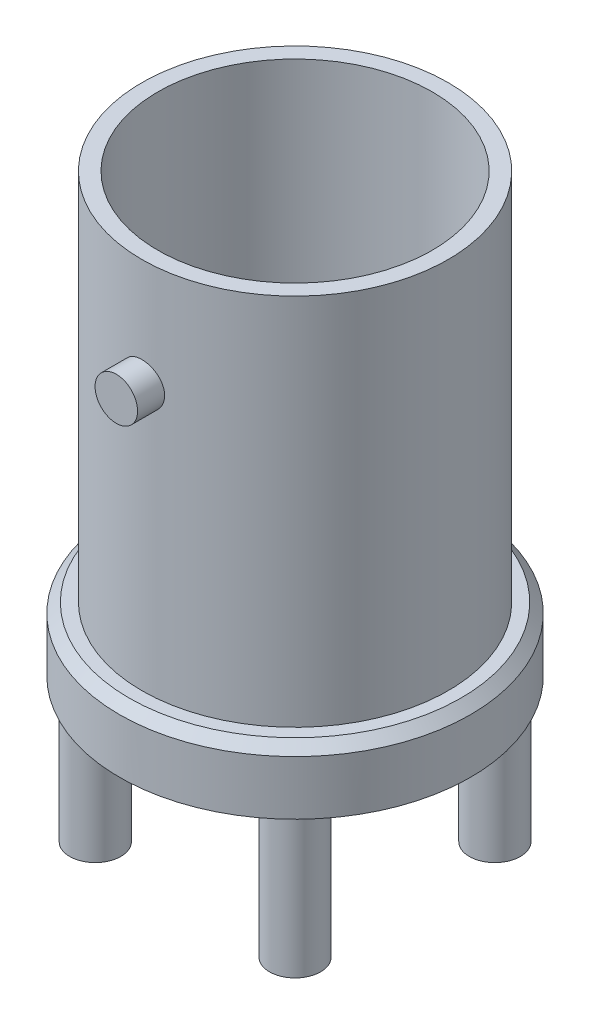
ISO-10303-21;
HEADER;
FILE_DESCRIPTION(('STEP AP214'),'2;1');
FILE_NAME('part.step','',(''),(''),'','','');
FILE_SCHEMA(('AUTOMOTIVE_DESIGN { 1 0 10303 214 1 1 1 1 }'));
ENDSEC;
DATA;
#1=APPLICATION_CONTEXT('core data for automotive mechanical design processes');
#2=APPLICATION_PROTOCOL_DEFINITION('international standard','automotive_design',2000,#1);
#3=PRODUCT_CONTEXT('',#1,'mechanical');
#4=PRODUCT('Part','Part','',(#3));
#5=PRODUCT_RELATED_PRODUCT_CATEGORY('part','',(#4));
#6=PRODUCT_DEFINITION_FORMATION('','',#4);
#7=PRODUCT_DEFINITION_CONTEXT('part definition',#1,'design');
#8=PRODUCT_DEFINITION('design','',#6,#7);
#9=PRODUCT_DEFINITION_SHAPE('','',#8);
#10=(LENGTH_UNIT() NAMED_UNIT(*) SI_UNIT(.MILLI.,.METRE.));
#11=(NAMED_UNIT(*) PLANE_ANGLE_UNIT() SI_UNIT($,.RADIAN.));
#12=(NAMED_UNIT(*) SI_UNIT($,.STERADIAN.) SOLID_ANGLE_UNIT());
#13=UNCERTAINTY_MEASURE_WITH_UNIT(LENGTH_MEASURE(1.E-05),#10,'distance_accuracy_value','');
#14=(GEOMETRIC_REPRESENTATION_CONTEXT(3) GLOBAL_UNCERTAINTY_ASSIGNED_CONTEXT((#13)) GLOBAL_UNIT_ASSIGNED_CONTEXT((#10,
#11,#12)) REPRESENTATION_CONTEXT('',''));
#15=CARTESIAN_POINT('',(0.,0.,0.));
#16=DIRECTION('',(0.,0.,1.));
#17=DIRECTION('',(1.,0.,0.));
#18=AXIS2_PLACEMENT_3D('',#15,#16,#17);
#19=CARTESIAN_POINT('',(0.,0.,0.));
#20=DIRECTION('',(0.,-1.,0.));
#21=DIRECTION('',(0.,0.,-1.));
#22=AXIS2_PLACEMENT_3D('',#19,#20,#21);
#23=CYLINDRICAL_SURFACE('',#22,4.8);
#24=CARTESIAN_POINT('',(0.,10.9866557356674,-4.8));
#25=CARTESIAN_POINT('',(0.0372305672435857,10.9866541772579,-4.79999943591072));
#26=CARTESIAN_POINT('',(0.0744835207053437,10.9835244096424,-4.79956228286493));
#27=CARTESIAN_POINT('',(0.147950338795849,10.9710899572942,-4.79786045376256));
#28=CARTESIAN_POINT('',(0.184163118882719,10.9617790553619,-4.79659494453453));
#29=CARTESIAN_POINT('',(0.254475568466827,10.9372640546069,-4.79337878338264));
#30=CARTESIAN_POINT('',(0.288576733046903,10.9220641819788,-4.7914286228898));
#31=CARTESIAN_POINT('',(0.353738543683553,10.8862125438414,-4.7870593102258));
#32=CARTESIAN_POINT('',(0.384799657431738,10.8655616187531,-4.78464023036597));
#33=CARTESIAN_POINT('',(0.443214506379492,10.8192457770284,-4.77958439018553));
#34=CARTESIAN_POINT('',(0.470544821254601,10.7935514523063,-4.77694640819485));
#35=CARTESIAN_POINT('',(0.520520361912578,10.7379414167379,-4.77175977663024));
#36=CARTESIAN_POINT('',(0.543165333142092,10.7080254766811,-4.76921113191622));
#37=CARTESIAN_POINT('',(0.583216778246804,10.6446663767408,-4.76447983009036));
#38=CARTESIAN_POINT('',(0.600600917251182,10.6112089702514,-4.76229875035522));
#39=CARTESIAN_POINT('',(0.629494542571579,10.5418140759254,-4.75856597725692));
#40=CARTESIAN_POINT('',(0.641004302890405,10.5058767038525,-4.7570142545389));
#41=CARTESIAN_POINT('',(0.657750418313272,10.4327869202716,-4.75472776086385));
#42=CARTESIAN_POINT('',(0.663026630302736,10.3956438058595,-4.75398780174465));
#43=CARTESIAN_POINT('',(0.667279283724438,10.3209925579391,-4.75339281430208));
#44=CARTESIAN_POINT('',(0.666256035712497,10.283484442516,-4.75353774235483));
#45=CARTESIAN_POINT('',(0.657971454816321,10.2094476747588,-4.75469140728667));
#46=CARTESIAN_POINT('',(0.650754282273152,10.1729139720338,-4.75569402897138));
#47=CARTESIAN_POINT('',(0.630355742930508,10.1015812177147,-4.75844056674966));
#48=CARTESIAN_POINT('',(0.617174229764157,10.0667822087137,-4.76018450103521));
#49=CARTESIAN_POINT('',(0.585174535251701,9.99977096901379,-4.76422400770246));
#50=CARTESIAN_POINT('',(0.566337421417103,9.96756789502594,-4.76652142772793));
#51=CARTESIAN_POINT('',(0.523574752895926,9.90676308104811,-4.77140766894461));
#52=CARTESIAN_POINT('',(0.499648911700272,9.87816154397879,-4.77399650653956));
#53=CARTESIAN_POINT('',(0.447144453588417,9.82511557615971,-4.77920098675282));
#54=CARTESIAN_POINT('',(0.418527823061185,9.80070875916859,-4.78181666938001));
#55=CARTESIAN_POINT('',(0.357584287752925,9.75703879099449,-4.78675950432496));
#56=CARTESIAN_POINT('',(0.32525737066453,9.73777565687429,-4.78908665568559));
#57=CARTESIAN_POINT('',(0.257779993072808,9.70493882982415,-4.79319216677937));
#58=CARTESIAN_POINT('',(0.222628229067748,9.69136778163162,-4.79497027130563));
#59=CARTESIAN_POINT('',(0.150514535006727,9.67033171909485,-4.79777513748893));
#60=CARTESIAN_POINT('',(0.113552709720074,9.66286635178551,-4.7988019425777));
#61=CARTESIAN_POINT('',(0.0391930135245538,9.65430298583646,-4.79998281598001));
#62=CARTESIAN_POINT('',(0.00180121167003114,9.65315322782203,-4.80014397839784));
#63=CARTESIAN_POINT('',(-0.0726416129808275,9.6571167045968,-4.79959464499947));
#64=CARTESIAN_POINT('',(-0.109692644745008,9.66222977409301,-4.7988841721881));
#65=CARTESIAN_POINT('',(-0.18224731101868,9.678530740402,-4.796675794642));
#66=CARTESIAN_POINT('',(-0.217756661339992,9.68969367245089,-4.79518112669276));
#67=CARTESIAN_POINT('',(-0.286399578240393,9.71775133769001,-4.79157152926214));
#68=CARTESIAN_POINT('',(-0.319533047371459,9.73464630582003,-4.78945657435744));
#69=CARTESIAN_POINT('',(-0.382712943967388,9.77381166952056,-4.78482411007179));
#70=CARTESIAN_POINT('',(-0.412738646135796,9.79611520354011,-4.78230415263116));
#71=CARTESIAN_POINT('',(-0.468639143930064,9.84541809913695,-4.77715049666598));
#72=CARTESIAN_POINT('',(-0.494513734487119,9.87241769256673,-4.77451679253038));
#73=CARTESIAN_POINT('',(-0.54156366341593,9.93057559405263,-4.76941026479457));
#74=CARTESIAN_POINT('',(-0.562704483352997,9.96176195568039,-4.76693871031928));
#75=CARTESIAN_POINT('',(-0.599447519365901,10.0272733964577,-4.76245805568987));
#76=CARTESIAN_POINT('',(-0.61504986756819,10.0615984007068,-4.76044894450405));
#77=CARTESIAN_POINT('',(-0.640218439390525,10.1323058745652,-4.75712960636872));
#78=CARTESIAN_POINT('',(-0.649803435823443,10.1686815555548,-4.75581720782732));
#79=CARTESIAN_POINT('',(-0.662725321597661,10.2425457355782,-4.75403390898769));
#80=CARTESIAN_POINT('',(-0.666062575513927,10.2800341695497,-4.7535629595884));
#81=CARTESIAN_POINT('',(-0.666386500618632,10.3547159679626,-4.75351753138721));
#82=CARTESIAN_POINT('',(-0.663427421223862,10.3919091039444,-4.75393539453582));
#83=CARTESIAN_POINT('',(-0.651358284873555,10.4652636111834,-4.75560395022369));
#84=CARTESIAN_POINT('',(-0.642248232448417,10.5014249832006,-4.75685464214953));
#85=CARTESIAN_POINT('',(-0.618153910196123,10.571678127684,-4.7600454014621));
#86=CARTESIAN_POINT('',(-0.603172883375382,10.6057710307443,-4.76198508820688));
#87=CARTESIAN_POINT('',(-0.567767210632652,10.6709681020131,-4.76633581834026));
#88=CARTESIAN_POINT('',(-0.547342434396933,10.7020721986505,-4.7687468730122));
#89=CARTESIAN_POINT('',(-0.501429919148226,10.7606851992116,-4.77379348906151));
#90=CARTESIAN_POINT('',(-0.47590186483371,10.7881623813836,-4.77643073601569));
#91=CARTESIAN_POINT('',(-0.420592385291024,10.8384627894217,-4.78161812652661));
#92=CARTESIAN_POINT('',(-0.390809966833686,10.8612849254857,-4.78416824957054));
#93=CARTESIAN_POINT('',(-0.327674574812205,10.9017211291018,-4.78890753502859));
#94=CARTESIAN_POINT('',(-0.294305524605614,10.9193102921479,-4.79109495010086));
#95=CARTESIAN_POINT('',(-0.225073746627821,10.9486090093766,-4.79484502380725));
#96=CARTESIAN_POINT('',(-0.189213707673959,10.9603247944648,-4.79640834416606));
#97=CARTESIAN_POINT('',(-0.127650679172182,10.9748170026485,-4.79836776872663));
#98=CARTESIAN_POINT('',(-0.102331771459389,10.9792499352586,-4.79897678852722));
#99=CARTESIAN_POINT('',(-0.0513454565050206,10.9851698246193,-4.79979309670435));
#100=CARTESIAN_POINT('',(-0.0256780527129196,10.986656810508,-4.80000038905435));
#101=CARTESIAN_POINT('',(0.,10.9866557356674,-4.8));
#102=B_SPLINE_CURVE_WITH_KNOTS('',3,(#24,#25,#26,#27,#28,#29,#30,#31,#32,#33,#34,#35,#36,#37,
#38,#39,#40,#41,#42,#43,#44,#45,#46,#47,#48,#49,#50,#51,#52,#53,#54,#55,#56,#57,#58,#59,#60,#61,
#62,#63,#64,#65,#66,#67,#68,#69,#70,#71,#72,#73,#74,#75,#76,#77,#78,#79,#80,#81,#82,#83,#84,#85,
#86,#87,#88,#89,#90,#91,#92,#93,#94,#95,#96,#97,#98,#99,#100,#101),.UNSPECIFIED.,.T.,.F.,(4,2,2,
2,2,2,2,2,2,2,2,2,2,2,2,2,2,2,2,2,2,2,2,2,2,2,2,2,2,2,2,2,2,2,2,2,2,2,4),(0.,0.11159788891167,
0.223308197274505,0.334938485268107,0.446551572600065,0.558835920879091,0.671126367933121,
0.783887063919969,0.896642499849001,1.00867301478618,1.12069800679759,1.23193087579668,
1.34316647463491,1.45477867422034,1.56639715953794,1.67896949414873,1.79154220218328,
1.90416715755256,2.01678560169246,2.1284796923273,2.24017083511565,2.35140455510968,
2.46264283480703,2.57458070513552,2.68652410359811,2.79925897245143,2.91199115170729,
3.02436986041962,3.13674201128468,3.24814988243331,3.3595576715264,3.47090400777541,
3.58225300969814,3.69451913353006,3.80681151011749,3.91963005470989,4.03232865858041,
4.10929887499883,4.18626833010747),.UNSPECIFIED.);
#103=CARTESIAN_POINT('',(0.,10.9866557356674,-4.8));
#104=VERTEX_POINT('',#103);
#105=EDGE_CURVE('E72',#104,#104,#102,.T.);
#106=ORIENTED_EDGE('',*,*,#105,.F.);
#107=EDGE_LOOP('',(#106));
#108=FACE_BOUND('',#107,.T.);
#109=CARTESIAN_POINT('',(0.,2.,0.));
#110=DIRECTION('',(0.,-1.,0.));
#111=DIRECTION('',(0.,0.,-1.));
#112=AXIS2_PLACEMENT_3D('',#109,#110,#111);
#113=CIRCLE('',#112,4.8);
#114=CARTESIAN_POINT('',(0.,2.,-4.8));
#115=VERTEX_POINT('',#114);
#116=EDGE_CURVE('E115',#115,#115,#113,.T.);
#117=ORIENTED_EDGE('',*,*,#116,.F.);
#118=EDGE_LOOP('',(#117));
#119=FACE_BOUND('',#118,.T.);
#120=CARTESIAN_POINT('',(0.,13.7,0.));
#121=DIRECTION('',(0.,-1.,0.));
#122=DIRECTION('',(0.,0.,-1.));
#123=AXIS2_PLACEMENT_3D('',#120,#121,#122);
#124=CIRCLE('',#123,4.8);
#125=CARTESIAN_POINT('',(0.,13.7,-4.8));
#126=VERTEX_POINT('',#125);
#127=EDGE_CURVE('E119',#126,#126,#124,.T.);
#128=ORIENTED_EDGE('',*,*,#127,.T.);
#129=EDGE_LOOP('',(#128));
#130=FACE_BOUND('',#129,.T.);
#131=CARTESIAN_POINT('',(0.666231496649461,10.320424239018,4.75353927015148));
#132=CARTESIAN_POINT('',(0.666229936550828,10.2831956191238,4.75353985491877));
#133=CARTESIAN_POINT('',(0.663100485282348,10.2459446075508,4.75398134695433));
#134=CARTESIAN_POINT('',(0.650667403557462,10.1724818235577,4.75569866580197));
#135=CARTESIAN_POINT('',(0.641357548952173,10.1362711372186,4.75697533368244));
#136=CARTESIAN_POINT('',(0.61684561134306,10.0659631170306,4.76021568093885));
#137=CARTESIAN_POINT('',(0.601647804125925,10.0318642703738,4.76217886167383));
#138=CARTESIAN_POINT('',(0.565801031449259,9.96670635131017,4.76657043804883));
#139=CARTESIAN_POINT('',(0.545152901425771,9.93564681403138,4.7689987623751));
#140=CARTESIAN_POINT('',(0.498839896527114,9.87723021685119,4.77406568459587));
#141=CARTESIAN_POINT('',(0.473144987927955,9.84989706909849,4.77670548237696));
#142=CARTESIAN_POINT('',(0.417532590897519,9.79991605179951,4.78188716776775));
#143=CARTESIAN_POINT('',(0.387614881030933,9.77726842810647,4.78442905023407));
#144=CARTESIAN_POINT('',(0.3242541987872,9.73721418391903,4.7891409431009));
#145=CARTESIAN_POINT('',(0.290797284297003,9.71982941810439,4.79130938712015));
#146=CARTESIAN_POINT('',(0.221403458245781,9.69093449866559,4.79501683306244));
#147=CARTESIAN_POINT('',(0.185466659406182,9.67942407822654,4.79655586357303));
#148=CARTESIAN_POINT('',(0.112378760040426,9.66267662084454,4.79882261620271));
#149=CARTESIAN_POINT('',(0.0752369711561885,9.65739965663439,4.79955549984281));
#150=CARTESIAN_POINT('',(0.000588328158090513,9.65314503936252,4.80014504361317));
#151=CARTESIAN_POINT('',(-0.0369185083603688,9.65416708417336,4.80000174576884));
#152=CARTESIAN_POINT('',(-0.110960513507225,9.66244973449761,4.79885922059703));
#153=CARTESIAN_POINT('',(-0.147500590279587,9.66966739184311,4.79786588589632));
#154=CARTESIAN_POINT('',(-0.218845841379247,9.6900691002499,4.79514147844014));
#155=CARTESIAN_POINT('',(-0.25365097637983,9.70325328648899,4.79341038897014));
#156=CARTESIAN_POINT('',(-0.320669741249341,9.73525856773205,4.78939482315632));
#157=CARTESIAN_POINT('',(-0.352874511650253,9.75409798019926,4.78710855323324));
#158=CARTESIAN_POINT('',(-0.413681748787757,9.79686558275932,4.78223789781825));
#159=CARTESIAN_POINT('',(-0.442284011962511,9.82079406020763,4.77965349549599));
#160=CARTESIAN_POINT('',(-0.495327098213319,9.87330042072059,4.77444957501159));
#161=CARTESIAN_POINT('',(-0.519730836863161,9.90191577116184,4.77182994443027));
#162=CARTESIAN_POINT('',(-0.563395199341171,9.96285563711392,4.7668721680603));
#163=CARTESIAN_POINT('',(-0.582655799507532,9.99518016968843,4.7645340235667));
#164=CARTESIAN_POINT('',(-0.615490790134166,10.0626568345223,4.76040402092981));
#165=CARTESIAN_POINT('',(-0.629061765382361,10.0978106500206,4.7586124910685));
#166=CARTESIAN_POINT('',(-0.650097056464327,10.1699288130797,4.75578463702071));
#167=CARTESIAN_POINT('',(-0.657561738121986,10.2068930520386,4.75474826759348));
#168=CARTESIAN_POINT('',(-0.66612251130172,10.2812539757682,4.75355652369583));
#169=CARTESIAN_POINT('',(-0.66727099318377,10.3186445171815,4.75339390209614));
#170=CARTESIAN_POINT('',(-0.663305413974282,10.393084516924,4.75394886167475));
#171=CARTESIAN_POINT('',(-0.658191518420339,10.4301339842431,4.7546664195867));
#172=CARTESIAN_POINT('',(-0.641890633539786,10.5026803313516,4.75689425186981));
#173=CARTESIAN_POINT('',(-0.630729400274337,10.5381831106737,4.75840116342753));
#174=CARTESIAN_POINT('',(-0.602677326308339,10.6068136345859,4.76203516315298));
#175=CARTESIAN_POINT('',(-0.58578624053281,10.6399412775142,4.76416227784724));
#176=CARTESIAN_POINT('',(-0.546626685821529,10.7031170341326,4.76881422278208));
#177=CARTESIAN_POINT('',(-0.524324094722432,10.7331438109639,4.77134153989527));
#178=CARTESIAN_POINT('',(-0.475022427493107,10.7890469144759,4.77650149029795));
#179=CARTESIAN_POINT('',(-0.448023125022194,10.8149230410156,4.77913412865831));
#180=CARTESIAN_POINT('',(-0.389864590022749,10.8619765329711,4.78423056145454));
#181=CARTESIAN_POINT('',(-0.358677244795139,10.8831193156139,4.78669302775924));
#182=CARTESIAN_POINT('',(-0.293163290076111,10.9198657919175,4.79115140184086));
#183=CARTESIAN_POINT('',(-0.258836756157651,10.9354696188792,4.79314732084536));
#184=CARTESIAN_POINT('',(-0.18813005095946,10.9606391178787,4.79644186187928));
#185=CARTESIAN_POINT('',(-0.151756898846228,10.9702242028695,4.79774272371246));
#186=CARTESIAN_POINT('',(-0.0778980720268035,10.9831471217806,4.79950993496685));
#187=CARTESIAN_POINT('',(-0.0404124599199314,10.9864853065461,4.79997633125417));
#188=CARTESIAN_POINT('',(0.0342707483084128,10.9868120468185,4.80002170909155));
#189=CARTESIAN_POINT('',(0.0714681186218029,10.9838537065705,4.79960811242203));
#190=CARTESIAN_POINT('',(0.144831284585171,10.971784563289,4.79795483700575));
#191=CARTESIAN_POINT('',(0.180997082226354,10.9626737721323,4.79671515985366));
#192=CARTESIAN_POINT('',(0.251259458928425,10.9385761940869,4.79354835486811));
#193=CARTESIAN_POINT('',(0.285357136157182,10.9235925577755,4.79162159568017));
#194=CARTESIAN_POINT('',(0.350562673992517,10.8881801806533,4.78729306077632));
#195=CARTESIAN_POINT('',(0.381670465997202,10.8677513149442,4.78489127416494));
#196=CARTESIAN_POINT('',(0.440283536335401,10.8218341824957,4.77985606681597));
#197=CARTESIAN_POINT('',(0.467757826145478,10.7963065432108,4.77722093836234));
#198=CARTESIAN_POINT('',(0.518052591654216,10.7409990998217,4.77202917989655));
#199=CARTESIAN_POINT('',(0.540871969822053,10.7112182957177,4.7694725685175));
#200=CARTESIAN_POINT('',(0.581305063896829,10.6480843349392,4.76471427290074));
#201=CARTESIAN_POINT('',(0.598893415732023,10.6147148073421,4.76251434080492));
#202=CARTESIAN_POINT('',(0.62819048579077,10.5454820430645,4.75873899611412));
#203=CARTESIAN_POINT('',(0.639905444084654,10.5096214992468,4.75716292109103));
#204=CARTESIAN_POINT('',(0.654395423899977,10.4480606604994,4.75518665488815));
#205=CARTESIAN_POINT('',(0.658827354666411,10.4227446029306,4.75457206644681));
#206=CARTESIAN_POINT('',(0.664745913917248,10.3717639909528,4.75374817450943));
#207=CARTESIAN_POINT('',(0.66623257259174,10.3460994401188,4.75353886685912));
#208=CARTESIAN_POINT('',(0.666231496649461,10.320424239018,4.75353927015148));
#209=B_SPLINE_CURVE_WITH_KNOTS('',3,(#131,#132,#133,#134,#135,#136,#137,#138,#139,#140,#141,
#142,#143,#144,#145,#146,#147,#148,#149,#150,#151,#152,#153,#154,#155,#156,#157,#158,#159,#160,
#161,#162,#163,#164,#165,#166,#167,#168,#169,#170,#171,#172,#173,#174,#175,#176,#177,#178,#179,
#180,#181,#182,#183,#184,#185,#186,#187,#188,#189,#190,#191,#192,#193,#194,#195,#196,#197,#198,
#199,#200,#201,#202,#203,#204,#205,#206,#207,#208),.UNSPECIFIED.,.T.,.F.,(4,2,2,2,2,2,2,2,2,2,2,
2,2,2,2,2,2,2,2,2,2,2,2,2,2,2,2,2,2,2,2,2,2,2,2,2,2,2,4),(0.,0.1115920382821,0.223296629293839,
0.334920252869538,0.446526776485515,0.558818782930531,0.671116679934418,0.783874705708062,
0.896627609515389,1.00865430995712,1.12067563716054,1.2319266429611,1.34318016939322,
1.4547980109505,1.56642215671421,1.67898659375677,1.79155154866056,1.90418397456506,
2.01680965224336,2.12849971971503,2.24018683487244,2.35140196324982,2.46262184907648,
2.57456213757059,2.68650782210934,2.79924649022674,2.91198244498288,3.02435288585459,
3.13671701546561,3.24813723458214,3.35955723861401,3.47091755132048,3.58228041854154,
3.6945390084525,3.8068240360761,3.91964495014693,4.03234574451791,4.10930743156226,
4.1862683297178),.UNSPECIFIED.);
#210=CARTESIAN_POINT('',(0.666231496649461,10.320424239018,4.75353927015148));
#211=VERTEX_POINT('',#210);
#212=EDGE_CURVE('E98',#211,#211,#209,.T.);
#213=ORIENTED_EDGE('',*,*,#212,.T.);
#214=EDGE_LOOP('',(#213));
#215=FACE_BOUND('',#214,.T.);
#216=ADVANCED_FACE('F36',(#108,#119,#130,#215),#23,.T.);
#217=CARTESIAN_POINT('',(0.,0.,-5.5));
#218=DIRECTION('',(0.,-1.,0.));
#219=DIRECTION('',(0.,0.,-1.));
#220=AXIS2_PLACEMENT_3D('',#217,#218,#219);
#221=PLANE('',#220);
#222=CARTESIAN_POINT('',(3.13000000000018,0.,-3.12999999999986));
#223=DIRECTION('',(0.,-1.,0.));
#224=DIRECTION('',(0.,0.,-1.));
#225=AXIS2_PLACEMENT_3D('',#222,#223,#224);
#226=CIRCLE('',#225,0.8);
#227=CARTESIAN_POINT('',(3.13000000000018,0.,-3.92999999999986));
#228=VERTEX_POINT('',#227);
#229=EDGE_CURVE('E244',#228,#228,#226,.T.);
#230=ORIENTED_EDGE('',*,*,#229,.F.);
#231=EDGE_LOOP('',(#230));
#232=FACE_BOUND('',#231,.T.);
#233=CARTESIAN_POINT('',(-3.12999999999984,0.,-3.13000000000002));
#234=DIRECTION('',(0.,-1.,0.));
#235=DIRECTION('',(0.,0.,-1.));
#236=AXIS2_PLACEMENT_3D('',#233,#234,#235);
#237=CIRCLE('',#236,0.799999999999999);
#238=CARTESIAN_POINT('',(-3.12999999999984,0.,-3.93000000000002));
#239=VERTEX_POINT('',#238);
#240=EDGE_CURVE('E237',#239,#239,#237,.T.);
#241=ORIENTED_EDGE('',*,*,#240,.F.);
#242=EDGE_LOOP('',(#241));
#243=FACE_BOUND('',#242,.T.);
#244=CARTESIAN_POINT('',(3.13000000000002,0.,3.13000000000016));
#245=DIRECTION('',(0.,-1.,0.));
#246=DIRECTION('',(0.,0.,-1.));
#247=AXIS2_PLACEMENT_3D('',#244,#245,#246);
#248=CIRCLE('',#247,0.8);
#249=CARTESIAN_POINT('',(3.13000000000002,0.,2.33000000000016));
#250=VERTEX_POINT('',#249);
#251=EDGE_CURVE('E231',#250,#250,#248,.T.);
#252=ORIENTED_EDGE('',*,*,#251,.F.);
#253=EDGE_LOOP('',(#252));
#254=FACE_BOUND('',#253,.T.);
#255=CARTESIAN_POINT('',(-3.13,0.,3.13));
#256=DIRECTION('',(0.,-1.,0.));
#257=DIRECTION('',(0.,0.,-1.));
#258=AXIS2_PLACEMENT_3D('',#255,#256,#257);
#259=CIRCLE('',#258,0.8);
#260=CARTESIAN_POINT('',(-3.13,0.,2.33));
#261=VERTEX_POINT('',#260);
#262=EDGE_CURVE('E223',#261,#261,#259,.T.);
#263=ORIENTED_EDGE('',*,*,#262,.F.);
#264=EDGE_LOOP('',(#263));
#265=FACE_BOUND('',#264,.T.);
#266=CARTESIAN_POINT('',(0.,0.,0.));
#267=DIRECTION('',(0.,-1.,0.));
#268=DIRECTION('',(0.,0.,-1.));
#269=AXIS2_PLACEMENT_3D('',#266,#267,#268);
#270=CIRCLE('',#269,0.55);
#271=CARTESIAN_POINT('',(0.,0.,-0.55));
#272=VERTEX_POINT('',#271);
#273=EDGE_CURVE('E215',#272,#272,#270,.T.);
#274=ORIENTED_EDGE('',*,*,#273,.F.);
#275=EDGE_LOOP('',(#274));
#276=FACE_BOUND('',#275,.T.);
#277=CARTESIAN_POINT('',(0.,0.,0.));
#278=DIRECTION('',(0.,-1.,0.));
#279=DIRECTION('',(0.,0.,-1.));
#280=AXIS2_PLACEMENT_3D('',#277,#278,#279);
#281=CIRCLE('',#280,5.5);
#282=CARTESIAN_POINT('',(0.,0.,-5.5));
#283=VERTEX_POINT('',#282);
#284=EDGE_CURVE('E111',#283,#283,#281,.T.);
#285=ORIENTED_EDGE('',*,*,#284,.T.);
#286=EDGE_LOOP('',(#285));
#287=FACE_BOUND('',#286,.T.);
#288=ADVANCED_FACE('F144',(#232,#243,#254,#265,#276,#287),#221,.T.);
#289=CARTESIAN_POINT('',(0.,2.,-0.286334311681459));
#290=DIRECTION('',(0.,1.,0.));
#291=DIRECTION('',(0.,0.,1.));
#292=AXIS2_PLACEMENT_3D('',#289,#290,#291);
#293=PLANE('',#292);
#294=CARTESIAN_POINT('',(0.,2.,0.));
#295=DIRECTION('',(0.,-1.,0.));
#296=DIRECTION('',(0.,0.,-1.));
#297=AXIS2_PLACEMENT_3D('',#294,#295,#296);
#298=CIRCLE('',#297,0.286334311681459);
#299=CARTESIAN_POINT('',(0.,2.,-0.286334311681459));
#300=VERTEX_POINT('',#299);
#301=EDGE_CURVE('E79',#300,#300,#298,.T.);
#302=ORIENTED_EDGE('',*,*,#301,.F.);
#303=EDGE_LOOP('',(#302));
#304=FACE_BOUND('',#303,.T.);
#305=ADVANCED_FACE('F142',(#304),#293,.T.);
#306=CARTESIAN_POINT('',(0.,0.,0.));
#307=DIRECTION('',(0.,-1.,0.));
#308=DIRECTION('',(0.,0.,-1.));
#309=AXIS2_PLACEMENT_3D('',#306,#307,#308);
#310=CYLINDRICAL_SURFACE('',#309,0.286334311681458);
#311=CARTESIAN_POINT('',(0.,9.18448865573098,0.));
#312=DIRECTION('',(0.,1.,0.));
#313=DIRECTION('',(0.,0.,1.));
#314=AXIS2_PLACEMENT_3D('',#311,#312,#313);
#315=CIRCLE('',#314,0.286334311681458);
#316=CARTESIAN_POINT('',(0.,9.18448865573098,0.286334311681458));
#317=VERTEX_POINT('',#316);
#318=EDGE_CURVE('E51',#317,#317,#315,.T.);
#319=ORIENTED_EDGE('',*,*,#318,.T.);
#320=EDGE_LOOP('',(#319));
#321=FACE_BOUND('',#320,.T.);
#322=ORIENTED_EDGE('',*,*,#301,.T.);
#323=EDGE_LOOP('',(#322));
#324=FACE_BOUND('',#323,.T.);
#325=ADVANCED_FACE('F140',(#321,#324),#310,.F.);
#326=CARTESIAN_POINT('',(0.,9.38448865573098,-1.72391680747972));
#327=DIRECTION('',(0.,1.,0.));
#328=DIRECTION('',(0.,0.,1.));
#329=AXIS2_PLACEMENT_3D('',#326,#327,#328);
#330=PLANE('',#329);
#331=CARTESIAN_POINT('',(0.,9.38448865573098,0.));
#332=DIRECTION('',(0.,1.,0.));
#333=DIRECTION('',(0.,0.,1.));
#334=AXIS2_PLACEMENT_3D('',#331,#332,#333);
#335=CIRCLE('',#334,1.32391680747972);
#336=CARTESIAN_POINT('',(0.,9.38448865573098,1.32391680747972));
#337=VERTEX_POINT('',#336);
#338=EDGE_CURVE('E10',#337,#337,#335,.T.);
#339=ORIENTED_EDGE('',*,*,#338,.T.);
#340=EDGE_LOOP('',(#339));
#341=FACE_BOUND('',#340,.T.);
#342=CARTESIAN_POINT('',(0.,9.38448865573098,0.));
#343=DIRECTION('',(0.,1.,0.));
#344=DIRECTION('',(0.,0.,1.));
#345=AXIS2_PLACEMENT_3D('',#342,#343,#344);
#346=CIRCLE('',#345,0.486334311681458);
#347=CARTESIAN_POINT('',(0.,9.38448865573098,0.486334311681458));
#348=VERTEX_POINT('',#347);
#349=EDGE_CURVE('E58',#348,#348,#346,.F.);
#350=ORIENTED_EDGE('',*,*,#349,.T.);
#351=EDGE_LOOP('',(#350));
#352=FACE_BOUND('',#351,.T.);
#353=ADVANCED_FACE('F150',(#341,#352),#330,.T.);
#354=CARTESIAN_POINT('',(0.,0.,0.));
#355=DIRECTION('',(0.,-1.,0.));
#356=DIRECTION('',(0.,0.,-1.));
#357=AXIS2_PLACEMENT_3D('',#354,#355,#356);
#358=CYLINDRICAL_SURFACE('',#357,1.72391680747972);
#359=CARTESIAN_POINT('',(0.,8.98448865573098,0.));
#360=DIRECTION('',(0.,1.,0.));
#361=DIRECTION('',(0.,0.,1.));
#362=AXIS2_PLACEMENT_3D('',#359,#360,#361);
#363=CIRCLE('',#362,1.72391680747972);
#364=CARTESIAN_POINT('',(0.,8.98448865573098,1.72391680747972));
#365=VERTEX_POINT('',#364);
#366=EDGE_CURVE('E44',#365,#365,#363,.F.);
#367=ORIENTED_EDGE('',*,*,#366,.T.);
#368=EDGE_LOOP('',(#367));
#369=FACE_BOUND('',#368,.T.);
#370=CARTESIAN_POINT('',(0.,2.,0.));
#371=DIRECTION('',(0.,-1.,0.));
#372=DIRECTION('',(0.,0.,-1.));
#373=AXIS2_PLACEMENT_3D('',#370,#371,#372);
#374=CIRCLE('',#373,1.72391680747972);
#375=CARTESIAN_POINT('',(0.,2.,-1.72391680747972));
#376=VERTEX_POINT('',#375);
#377=EDGE_CURVE('E129',#376,#376,#374,.T.);
#378=ORIENTED_EDGE('',*,*,#377,.F.);
#379=EDGE_LOOP('',(#378));
#380=FACE_BOUND('',#379,.T.);
#381=ADVANCED_FACE('F395',(#369,#380),#358,.T.);
#382=CARTESIAN_POINT('',(0.,2.,-4.3));
#383=DIRECTION('',(0.,1.,0.));
#384=DIRECTION('',(0.,0.,1.));
#385=AXIS2_PLACEMENT_3D('',#382,#383,#384);
#386=PLANE('',#385);
#387=ORIENTED_EDGE('',*,*,#377,.T.);
#388=EDGE_LOOP('',(#387));
#389=FACE_BOUND('',#388,.T.);
#390=CARTESIAN_POINT('',(0.,2.,0.));
#391=DIRECTION('',(0.,-1.,0.));
#392=DIRECTION('',(0.,0.,-1.));
#393=AXIS2_PLACEMENT_3D('',#390,#391,#392);
#394=CIRCLE('',#393,4.3);
#395=CARTESIAN_POINT('',(0.,2.,-4.3));
#396=VERTEX_POINT('',#395);
#397=EDGE_CURVE('E126',#396,#396,#394,.T.);
#398=ORIENTED_EDGE('',*,*,#397,.F.);
#399=EDGE_LOOP('',(#398));
#400=FACE_BOUND('',#399,.T.);
#401=ADVANCED_FACE('F386',(#389,#400),#386,.T.);
#402=CARTESIAN_POINT('',(0.,0.,0.));
#403=DIRECTION('',(0.,-1.,0.));
#404=DIRECTION('',(0.,0.,-1.));
#405=AXIS2_PLACEMENT_3D('',#402,#403,#404);
#406=CYLINDRICAL_SURFACE('',#405,4.3);
#407=ORIENTED_EDGE('',*,*,#397,.T.);
#408=EDGE_LOOP('',(#407));
#409=FACE_BOUND('',#408,.T.);
#410=CARTESIAN_POINT('',(0.,13.7,0.));
#411=DIRECTION('',(0.,-1.,0.));
#412=DIRECTION('',(0.,0.,-1.));
#413=AXIS2_PLACEMENT_3D('',#410,#411,#412);
#414=CIRCLE('',#413,4.3);
#415=CARTESIAN_POINT('',(0.,13.7,-4.3));
#416=VERTEX_POINT('',#415);
#417=EDGE_CURVE('E123',#416,#416,#414,.T.);
#418=ORIENTED_EDGE('',*,*,#417,.F.);
#419=EDGE_LOOP('',(#418));
#420=FACE_BOUND('',#419,.T.);
#421=ADVANCED_FACE('F187',(#409,#420),#406,.F.);
#422=CARTESIAN_POINT('',(0.,13.7,-4.3));
#423=DIRECTION('',(0.,1.,0.));
#424=DIRECTION('',(0.,0.,1.));
#425=AXIS2_PLACEMENT_3D('',#422,#423,#424);
#426=PLANE('',#425);
#427=ORIENTED_EDGE('',*,*,#417,.T.);
#428=EDGE_LOOP('',(#427));
#429=FACE_BOUND('',#428,.T.);
#430=ORIENTED_EDGE('',*,*,#127,.F.);
#431=EDGE_LOOP('',(#430));
#432=FACE_BOUND('',#431,.T.);
#433=ADVANCED_FACE('F182',(#429,#432),#426,.T.);
#434=CARTESIAN_POINT('',(0.,2.,-4.8));
#435=DIRECTION('',(0.,1.,0.));
#436=DIRECTION('',(0.,0.,1.));
#437=AXIS2_PLACEMENT_3D('',#434,#435,#436);
#438=PLANE('',#437);
#439=CARTESIAN_POINT('',(0.,2.,0.));
#440=DIRECTION('',(0.,1.,0.));
#441=DIRECTION('',(0.,0.,1.));
#442=AXIS2_PLACEMENT_3D('',#439,#440,#441);
#443=CIRCLE('',#442,5.2);
#444=CARTESIAN_POINT('',(0.,2.,5.2));
#445=VERTEX_POINT('',#444);
#446=EDGE_CURVE('E64',#445,#445,#443,.T.);
#447=ORIENTED_EDGE('',*,*,#446,.T.);
#448=EDGE_LOOP('',(#447));
#449=FACE_BOUND('',#448,.T.);
#450=ORIENTED_EDGE('',*,*,#116,.T.);
#451=EDGE_LOOP('',(#450));
#452=FACE_BOUND('',#451,.T.);
#453=ADVANCED_FACE('F177',(#449,#452),#438,.T.);
#454=CARTESIAN_POINT('',(0.,0.,0.));
#455=DIRECTION('',(0.,-1.,0.));
#456=DIRECTION('',(0.,0.,-1.));
#457=AXIS2_PLACEMENT_3D('',#454,#455,#456);
#458=CYLINDRICAL_SURFACE('',#457,5.5);
#459=CARTESIAN_POINT('',(0.,1.7,0.));
#460=DIRECTION('',(0.,1.,0.));
#461=DIRECTION('',(0.,0.,1.));
#462=AXIS2_PLACEMENT_3D('',#459,#460,#461);
#463=CIRCLE('',#462,5.5);
#464=CARTESIAN_POINT('',(0.,1.7,5.5));
#465=VERTEX_POINT('',#464);
#466=EDGE_CURVE('E68',#465,#465,#463,.F.);
#467=ORIENTED_EDGE('',*,*,#466,.T.);
#468=EDGE_LOOP('',(#467));
#469=FACE_BOUND('',#468,.T.);
#470=ORIENTED_EDGE('',*,*,#284,.F.);
#471=EDGE_LOOP('',(#470));
#472=FACE_BOUND('',#471,.T.);
#473=ADVANCED_FACE('F169',(#469,#472),#458,.T.);
#474=CARTESIAN_POINT('',(0.,10.320424239018,5.6));
#475=DIRECTION('',(0.,0.,-1.));
#476=DIRECTION('',(-1.,0.,0.));
#477=AXIS2_PLACEMENT_3D('',#474,#475,#476);
#478=CYLINDRICAL_SURFACE('',#477,0.666231496649461);
#479=CARTESIAN_POINT('',(0.,10.320424239018,5.6));
#480=DIRECTION('',(0.,0.,1.));
#481=DIRECTION('',(1.,0.,0.));
#482=AXIS2_PLACEMENT_3D('',#479,#480,#481);
#483=CIRCLE('',#482,0.666231496649461);
#484=CARTESIAN_POINT('',(0.666231496649461,10.320424239018,5.6));
#485=VERTEX_POINT('',#484);
#486=EDGE_CURVE('E105',#485,#485,#483,.T.);
#487=ORIENTED_EDGE('',*,*,#486,.F.);
#488=EDGE_LOOP('',(#487));
#489=FACE_BOUND('',#488,.T.);
#490=ORIENTED_EDGE('',*,*,#212,.F.);
#491=EDGE_LOOP('',(#490));
#492=FACE_BOUND('',#491,.T.);
#493=ADVANCED_FACE('F167',(#489,#492),#478,.T.);
#494=CARTESIAN_POINT('',(0.,10.320424239018,5.6));
#495=DIRECTION('',(0.,0.,1.));
#496=DIRECTION('',(1.,0.,0.));
#497=AXIS2_PLACEMENT_3D('',#494,#495,#496);
#498=PLANE('',#497);
#499=ORIENTED_EDGE('',*,*,#486,.T.);
#500=EDGE_LOOP('',(#499));
#501=FACE_BOUND('',#500,.T.);
#502=ADVANCED_FACE('F90',(#501),#498,.T.);
#503=CARTESIAN_POINT('',(0.,10.320424239018,-5.6));
#504=DIRECTION('',(0.,0.,1.));
#505=DIRECTION('',(1.,0.,0.));
#506=AXIS2_PLACEMENT_3D('',#503,#504,#505);
#507=CYLINDRICAL_SURFACE('',#506,0.666231496649461);
#508=CARTESIAN_POINT('',(0.,10.320424239018,-5.6));
#509=DIRECTION('',(0.,0.,1.));
#510=DIRECTION('',(1.,0.,0.));
#511=AXIS2_PLACEMENT_3D('',#508,#509,#510);
#512=CIRCLE('',#511,0.666231496649461);
#513=CARTESIAN_POINT('',(0.666231496649461,10.320424239018,-5.6));
#514=VERTEX_POINT('',#513);
#515=EDGE_CURVE('E106',#514,#514,#512,.T.);
#516=ORIENTED_EDGE('',*,*,#515,.T.);
#517=EDGE_LOOP('',(#516));
#518=FACE_BOUND('',#517,.T.);
#519=ORIENTED_EDGE('',*,*,#105,.T.);
#520=EDGE_LOOP('',(#519));
#521=FACE_BOUND('',#520,.T.);
#522=ADVANCED_FACE('F84',(#518,#521),#507,.T.);
#523=CARTESIAN_POINT('',(0.,10.320424239018,-5.6));
#524=DIRECTION('',(0.,0.,-1.));
#525=DIRECTION('',(1.,0.,0.));
#526=AXIS2_PLACEMENT_3D('',#523,#524,#525);
#527=PLANE('',#526);
#528=ORIENTED_EDGE('',*,*,#515,.F.);
#529=EDGE_LOOP('',(#528));
#530=FACE_BOUND('',#529,.T.);
#531=ADVANCED_FACE('F89',(#530),#527,.T.);
#532=CARTESIAN_POINT('',(0.,1.7,0.));
#533=DIRECTION('',(0.,-1.,0.));
#534=DIRECTION('',(0.,0.,-1.));
#535=AXIS2_PLACEMENT_3D('',#532,#533,#534);
#536=CONICAL_SURFACE('',#535,5.5,0.785398163397451);
#537=ORIENTED_EDGE('',*,*,#446,.F.);
#538=EDGE_LOOP('',(#537));
#539=FACE_BOUND('',#538,.T.);
#540=ORIENTED_EDGE('',*,*,#466,.F.);
#541=EDGE_LOOP('',(#540));
#542=FACE_BOUND('',#541,.T.);
#543=ADVANCED_FACE('F192',(#539,#542),#536,.T.);
#544=CARTESIAN_POINT('',(0.,9.18448865573098,0.));
#545=DIRECTION('',(0.,1.,0.));
#546=DIRECTION('',(0.,0.,1.));
#547=AXIS2_PLACEMENT_3D('',#544,#545,#546);
#548=TOROIDAL_SURFACE('',#547,0.486334311681458,0.2);
#549=ORIENTED_EDGE('',*,*,#318,.F.);
#550=EDGE_LOOP('',(#549));
#551=FACE_BOUND('',#550,.T.);
#552=ORIENTED_EDGE('',*,*,#349,.F.);
#553=EDGE_LOOP('',(#552));
#554=FACE_BOUND('',#553,.T.);
#555=ADVANCED_FACE('F195',(#551,#554),#548,.T.);
#556=CARTESIAN_POINT('',(0.,8.98448865573098,0.));
#557=DIRECTION('',(0.,-1.,0.));
#558=DIRECTION('',(0.,0.,-1.));
#559=AXIS2_PLACEMENT_3D('',#556,#557,#558);
#560=CONICAL_SURFACE('',#559,1.72391680747972,0.785398163397448);
#561=ORIENTED_EDGE('',*,*,#338,.F.);
#562=EDGE_LOOP('',(#561));
#563=FACE_BOUND('',#562,.T.);
#564=ORIENTED_EDGE('',*,*,#366,.F.);
#565=EDGE_LOOP('',(#564));
#566=FACE_BOUND('',#565,.T.);
#567=ADVANCED_FACE('F38',(#563,#566),#560,.T.);
#568=CARTESIAN_POINT('',(0.,-4.9,0.));
#569=DIRECTION('',(0.,1.,0.));
#570=DIRECTION('',(0.,0.,1.));
#571=AXIS2_PLACEMENT_3D('',#568,#569,#570);
#572=CYLINDRICAL_SURFACE('',#571,0.55);
#573=CARTESIAN_POINT('',(0.,-4.9,0.));
#574=DIRECTION('',(0.,-1.,0.));
#575=DIRECTION('',(0.,0.,-1.));
#576=AXIS2_PLACEMENT_3D('',#573,#574,#575);
#577=CIRCLE('',#576,0.55);
#578=CARTESIAN_POINT('',(0.,-4.9,-0.55));
#579=VERTEX_POINT('',#578);
#580=EDGE_CURVE('E212',#579,#579,#577,.T.);
#581=ORIENTED_EDGE('',*,*,#580,.F.);
#582=EDGE_LOOP('',(#581));
#583=FACE_BOUND('',#582,.T.);
#584=ORIENTED_EDGE('',*,*,#273,.T.);
#585=EDGE_LOOP('',(#584));
#586=FACE_BOUND('',#585,.T.);
#587=ADVANCED_FACE('F268',(#583,#586),#572,.T.);
#588=CARTESIAN_POINT('',(0.,-4.9,0.));
#589=DIRECTION('',(0.,-1.,0.));
#590=DIRECTION('',(0.,0.,-1.));
#591=AXIS2_PLACEMENT_3D('',#588,#589,#590);
#592=PLANE('',#591);
#593=ORIENTED_EDGE('',*,*,#580,.T.);
#594=EDGE_LOOP('',(#593));
#595=FACE_BOUND('',#594,.T.);
#596=ADVANCED_FACE('F270',(#595),#592,.T.);
#597=CARTESIAN_POINT('',(-3.13,-4.5,3.13));
#598=DIRECTION('',(0.,1.,0.));
#599=DIRECTION('',(0.,0.,1.));
#600=AXIS2_PLACEMENT_3D('',#597,#598,#599);
#601=CYLINDRICAL_SURFACE('',#600,0.8);
#602=CARTESIAN_POINT('',(-3.13,-4.5,3.13));
#603=DIRECTION('',(0.,-1.,0.));
#604=DIRECTION('',(0.,0.,-1.));
#605=AXIS2_PLACEMENT_3D('',#602,#603,#604);
#606=CIRCLE('',#605,0.8);
#607=CARTESIAN_POINT('',(-3.13,-4.5,2.33));
#608=VERTEX_POINT('',#607);
#609=EDGE_CURVE('E221',#608,#608,#606,.T.);
#610=ORIENTED_EDGE('',*,*,#609,.F.);
#611=EDGE_LOOP('',(#610));
#612=FACE_BOUND('',#611,.T.);
#613=ORIENTED_EDGE('',*,*,#262,.T.);
#614=EDGE_LOOP('',(#613));
#615=FACE_BOUND('',#614,.T.);
#616=ADVANCED_FACE('F276',(#612,#615),#601,.T.);
#617=CARTESIAN_POINT('',(0.,-4.5,0.));
#618=DIRECTION('',(0.,-1.,0.));
#619=DIRECTION('',(0.,0.,-1.));
#620=AXIS2_PLACEMENT_3D('',#617,#618,#619);
#621=PLANE('',#620);
#622=ORIENTED_EDGE('',*,*,#609,.T.);
#623=EDGE_LOOP('',(#622));
#624=FACE_BOUND('',#623,.T.);
#625=ADVANCED_FACE('F282',(#624),#621,.T.);
#626=CARTESIAN_POINT('',(3.13000000000002,-4.5,3.13000000000016));
#627=DIRECTION('',(0.,1.,0.));
#628=DIRECTION('',(0.,0.,1.));
#629=AXIS2_PLACEMENT_3D('',#626,#627,#628);
#630=CYLINDRICAL_SURFACE('',#629,0.8);
#631=CARTESIAN_POINT('',(3.13000000000002,-4.5,3.13000000000016));
#632=DIRECTION('',(0.,-1.,0.));
#633=DIRECTION('',(0.,0.,-1.));
#634=AXIS2_PLACEMENT_3D('',#631,#632,#633);
#635=CIRCLE('',#634,0.8);
#636=CARTESIAN_POINT('',(3.13000000000002,-4.5,2.33000000000016));
#637=VERTEX_POINT('',#636);
#638=EDGE_CURVE('E227',#637,#637,#635,.T.);
#639=ORIENTED_EDGE('',*,*,#638,.F.);
#640=EDGE_LOOP('',(#639));
#641=FACE_BOUND('',#640,.T.);
#642=ORIENTED_EDGE('',*,*,#251,.T.);
#643=EDGE_LOOP('',(#642));
#644=FACE_BOUND('',#643,.T.);
#645=ADVANCED_FACE('F286',(#641,#644),#630,.T.);
#646=CARTESIAN_POINT('',(0.,-4.5,0.));
#647=DIRECTION('',(0.,-1.,0.));
#648=DIRECTION('',(0.,0.,-1.));
#649=AXIS2_PLACEMENT_3D('',#646,#647,#648);
#650=PLANE('',#649);
#651=ORIENTED_EDGE('',*,*,#638,.T.);
#652=EDGE_LOOP('',(#651));
#653=FACE_BOUND('',#652,.T.);
#654=ADVANCED_FACE('F290',(#653),#650,.T.);
#655=CARTESIAN_POINT('',(-3.12999999999984,-4.5,-3.13000000000002));
#656=DIRECTION('',(0.,1.,0.));
#657=DIRECTION('',(0.,0.,1.));
#658=AXIS2_PLACEMENT_3D('',#655,#656,#657);
#659=CYLINDRICAL_SURFACE('',#658,0.799999999999999);
#660=CARTESIAN_POINT('',(-3.12999999999984,-4.5,-3.13000000000002));
#661=DIRECTION('',(0.,-1.,0.));
#662=DIRECTION('',(0.,0.,-1.));
#663=AXIS2_PLACEMENT_3D('',#660,#661,#662);
#664=CIRCLE('',#663,0.799999999999999);
#665=CARTESIAN_POINT('',(-3.12999999999984,-4.5,-3.93000000000002));
#666=VERTEX_POINT('',#665);
#667=EDGE_CURVE('E234',#666,#666,#664,.T.);
#668=ORIENTED_EDGE('',*,*,#667,.F.);
#669=EDGE_LOOP('',(#668));
#670=FACE_BOUND('',#669,.T.);
#671=ORIENTED_EDGE('',*,*,#240,.T.);
#672=EDGE_LOOP('',(#671));
#673=FACE_BOUND('',#672,.T.);
#674=ADVANCED_FACE('F294',(#670,#673),#659,.T.);
#675=CARTESIAN_POINT('',(0.,-4.5,0.));
#676=DIRECTION('',(0.,-1.,0.));
#677=DIRECTION('',(0.,0.,-1.));
#678=AXIS2_PLACEMENT_3D('',#675,#676,#677);
#679=PLANE('',#678);
#680=ORIENTED_EDGE('',*,*,#667,.T.);
#681=EDGE_LOOP('',(#680));
#682=FACE_BOUND('',#681,.T.);
#683=ADVANCED_FACE('F256',(#682),#679,.T.);
#684=CARTESIAN_POINT('',(3.13000000000018,-4.5,-3.12999999999986));
#685=DIRECTION('',(0.,1.,0.));
#686=DIRECTION('',(0.,0.,1.));
#687=AXIS2_PLACEMENT_3D('',#684,#685,#686);
#688=CYLINDRICAL_SURFACE('',#687,0.8);
#689=CARTESIAN_POINT('',(3.13000000000018,-4.5,-3.12999999999986));
#690=DIRECTION('',(0.,-1.,0.));
#691=DIRECTION('',(0.,0.,-1.));
#692=AXIS2_PLACEMENT_3D('',#689,#690,#691);
#693=CIRCLE('',#692,0.8);
#694=CARTESIAN_POINT('',(3.13000000000018,-4.5,-3.92999999999986));
#695=VERTEX_POINT('',#694);
#696=EDGE_CURVE('E241',#695,#695,#693,.T.);
#697=ORIENTED_EDGE('',*,*,#696,.F.);
#698=EDGE_LOOP('',(#697));
#699=FACE_BOUND('',#698,.T.);
#700=ORIENTED_EDGE('',*,*,#229,.T.);
#701=EDGE_LOOP('',(#700));
#702=FACE_BOUND('',#701,.T.);
#703=ADVANCED_FACE('F253',(#699,#702),#688,.T.);
#704=CARTESIAN_POINT('',(0.,-4.5,0.));
#705=DIRECTION('',(0.,-1.,0.));
#706=DIRECTION('',(0.,0.,-1.));
#707=AXIS2_PLACEMENT_3D('',#704,#705,#706);
#708=PLANE('',#707);
#709=ORIENTED_EDGE('',*,*,#696,.T.);
#710=EDGE_LOOP('',(#709));
#711=FACE_BOUND('',#710,.T.);
#712=ADVANCED_FACE('F251',(#711),#708,.T.);
#713=CLOSED_SHELL('',(#216,#288,#305,#325,#353,#381,#401,#421,#433,#453,#473,#493,#502,#522,
#531,#543,#555,#567,#587,#596,#616,#625,#645,#654,#674,#683,#703,#712));
#714=MANIFOLD_SOLID_BREP('B2',#713);
#715=ADVANCED_BREP_SHAPE_REPRESENTATION('',(#18,#714),#14);
#716=SHAPE_DEFINITION_REPRESENTATION(#9,#715);
ENDSEC;
END-ISO-10303-21;
